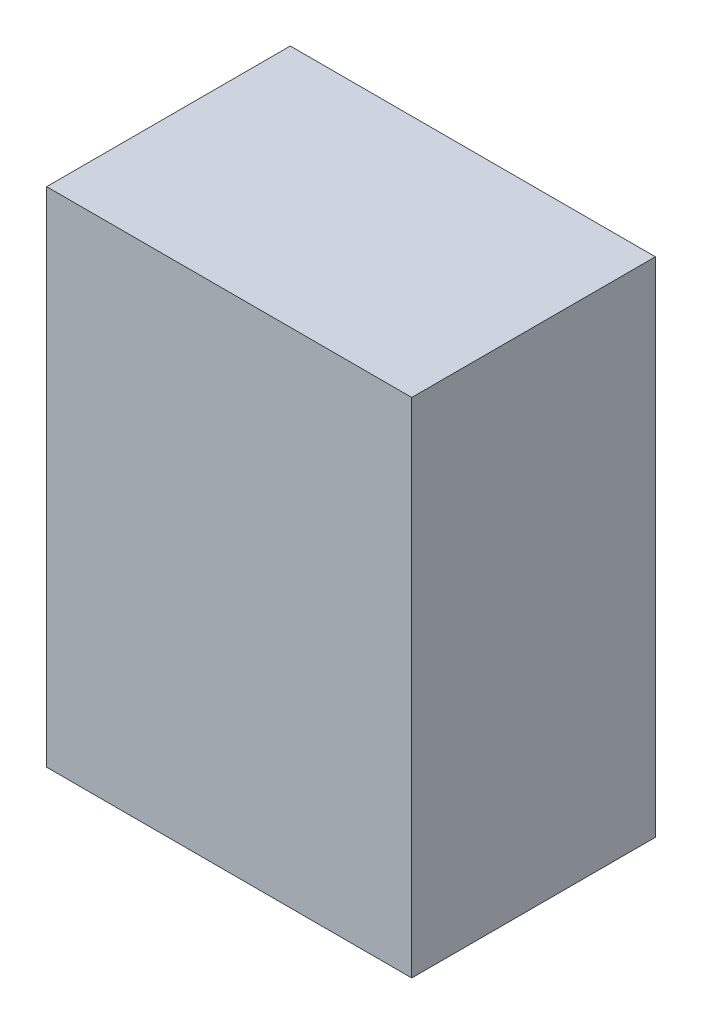
ISO-10303-21;
HEADER;
FILE_DESCRIPTION(('STEP AP214'),'2;1');
FILE_NAME('part.step','',(''),(''),'','','');
FILE_SCHEMA(('AUTOMOTIVE_DESIGN { 1 0 10303 214 1 1 1 1 }'));
ENDSEC;
DATA;
#1=APPLICATION_CONTEXT('core data for automotive mechanical design processes');
#2=APPLICATION_PROTOCOL_DEFINITION('international standard','automotive_design',2000,#1);
#3=PRODUCT_CONTEXT('',#1,'mechanical');
#4=PRODUCT('Part','Part','',(#3));
#5=PRODUCT_RELATED_PRODUCT_CATEGORY('part','',(#4));
#6=PRODUCT_DEFINITION_FORMATION('','',#4);
#7=PRODUCT_DEFINITION_CONTEXT('part definition',#1,'design');
#8=PRODUCT_DEFINITION('design','',#6,#7);
#9=PRODUCT_DEFINITION_SHAPE('','',#8);
#10=(LENGTH_UNIT() NAMED_UNIT(*) SI_UNIT(.MILLI.,.METRE.));
#11=(NAMED_UNIT(*) PLANE_ANGLE_UNIT() SI_UNIT($,.RADIAN.));
#12=(NAMED_UNIT(*) SI_UNIT($,.STERADIAN.) SOLID_ANGLE_UNIT());
#13=UNCERTAINTY_MEASURE_WITH_UNIT(LENGTH_MEASURE(1.E-05),#10,'distance_accuracy_value','');
#14=(GEOMETRIC_REPRESENTATION_CONTEXT(3) GLOBAL_UNCERTAINTY_ASSIGNED_CONTEXT((#13)) GLOBAL_UNIT_ASSIGNED_CONTEXT((#10,
#11,#12)) REPRESENTATION_CONTEXT('',''));
#15=CARTESIAN_POINT('',(0.,0.,0.));
#16=DIRECTION('',(0.,0.,1.));
#17=DIRECTION('',(1.,0.,0.));
#18=AXIS2_PLACEMENT_3D('',#15,#16,#17);
#19=CARTESIAN_POINT('',(4.3942,6.2484,10.));
#20=DIRECTION('',(0.,0.,-1.));
#21=DIRECTION('',(-1.,0.,0.));
#22=AXIS2_PLACEMENT_3D('',#19,#20,#21);
#23=PLANE('',#22);
#24=DIRECTION('',(0.,1.,0.));
#25=VECTOR('',#24,1.);
#26=CARTESIAN_POINT('',(-7.5946,6.2484,10.));
#27=LINE('',#26,#25);
#28=CARTESIAN_POINT('',(-7.5946,6.2484,10.));
#29=VERTEX_POINT('',#28);
#30=CARTESIAN_POINT('',(-7.5946,-10.2616,10.));
#31=VERTEX_POINT('',#30);
#32=EDGE_CURVE('E55',#29,#31,#27,.F.);
#33=ORIENTED_EDGE('',*,*,#32,.T.);
#34=DIRECTION('',(1.,0.,0.));
#35=VECTOR('',#34,1.);
#36=CARTESIAN_POINT('',(-7.5946,-10.2616,10.));
#37=LINE('',#36,#35);
#38=CARTESIAN_POINT('',(4.3942,-10.2616,10.));
#39=VERTEX_POINT('',#38);
#40=EDGE_CURVE('E57',#31,#39,#37,.T.);
#41=ORIENTED_EDGE('',*,*,#40,.T.);
#42=DIRECTION('',(0.,1.,0.));
#43=VECTOR('',#42,1.);
#44=CARTESIAN_POINT('',(4.3942,-10.2616,10.));
#45=LINE('',#44,#43);
#46=CARTESIAN_POINT('',(4.3942,6.2484,10.));
#47=VERTEX_POINT('',#46);
#48=EDGE_CURVE('E20',#39,#47,#45,.T.);
#49=ORIENTED_EDGE('',*,*,#48,.T.);
#50=DIRECTION('',(1.,0.,0.));
#51=VECTOR('',#50,1.);
#52=CARTESIAN_POINT('',(4.3942,6.2484,10.));
#53=LINE('',#52,#51);
#54=EDGE_CURVE('E80',#47,#29,#53,.F.);
#55=ORIENTED_EDGE('',*,*,#54,.T.);
#56=EDGE_LOOP('',(#33,#41,#49,#55));
#57=FACE_BOUND('',#56,.T.);
#58=ADVANCED_FACE('F17',(#57),#23,.F.);
#59=CARTESIAN_POINT('',(4.3942,-10.2616,2.));
#60=DIRECTION('',(-1.,0.,0.));
#61=DIRECTION('',(0.,0.,1.));
#62=AXIS2_PLACEMENT_3D('',#59,#60,#61);
#63=PLANE('',#62);
#64=DIRECTION('',(0.,0.,-1.));
#65=VECTOR('',#64,1.);
#66=CARTESIAN_POINT('',(4.3942,6.2484,2.));
#67=LINE('',#66,#65);
#68=CARTESIAN_POINT('',(4.3942,6.2484,2.));
#69=VERTEX_POINT('',#68);
#70=EDGE_CURVE('E68',#69,#47,#67,.F.);
#71=ORIENTED_EDGE('',*,*,#70,.T.);
#72=ORIENTED_EDGE('',*,*,#48,.F.);
#73=DIRECTION('',(0.,0.,1.));
#74=VECTOR('',#73,1.);
#75=CARTESIAN_POINT('',(4.3942,-10.2616,2.));
#76=LINE('',#75,#74);
#77=CARTESIAN_POINT('',(4.3942,-10.2616,2.));
#78=VERTEX_POINT('',#77);
#79=EDGE_CURVE('E63',#39,#78,#76,.F.);
#80=ORIENTED_EDGE('',*,*,#79,.T.);
#81=DIRECTION('',(0.,1.,0.));
#82=VECTOR('',#81,1.);
#83=CARTESIAN_POINT('',(4.3942,6.2484,2.));
#84=LINE('',#83,#82);
#85=EDGE_CURVE('E83',#69,#78,#84,.F.);
#86=ORIENTED_EDGE('',*,*,#85,.F.);
#87=EDGE_LOOP('',(#71,#72,#80,#86));
#88=FACE_BOUND('',#87,.T.);
#89=ADVANCED_FACE('F65',(#88),#63,.F.);
#90=CARTESIAN_POINT('',(-7.5946,-10.2616,2.));
#91=DIRECTION('',(0.,1.,0.));
#92=DIRECTION('',(0.,0.,1.));
#93=AXIS2_PLACEMENT_3D('',#90,#91,#92);
#94=PLANE('',#93);
#95=ORIENTED_EDGE('',*,*,#79,.F.);
#96=ORIENTED_EDGE('',*,*,#40,.F.);
#97=DIRECTION('',(0.,0.,-1.));
#98=VECTOR('',#97,1.);
#99=CARTESIAN_POINT('',(-7.5946,-10.2616,2.));
#100=LINE('',#99,#98);
#101=CARTESIAN_POINT('',(-7.5946,-10.2616,2.));
#102=VERTEX_POINT('',#101);
#103=EDGE_CURVE('E75',#31,#102,#100,.T.);
#104=ORIENTED_EDGE('',*,*,#103,.T.);
#105=DIRECTION('',(-1.,0.,0.));
#106=VECTOR('',#105,1.);
#107=CARTESIAN_POINT('',(4.3942,-10.2616,2.));
#108=LINE('',#107,#106);
#109=EDGE_CURVE('E72',#78,#102,#108,.T.);
#110=ORIENTED_EDGE('',*,*,#109,.F.);
#111=EDGE_LOOP('',(#95,#96,#104,#110));
#112=FACE_BOUND('',#111,.T.);
#113=ADVANCED_FACE('F70',(#112),#94,.F.);
#114=CARTESIAN_POINT('',(-7.5946,6.2484,2.));
#115=DIRECTION('',(1.,0.,0.));
#116=DIRECTION('',(0.,0.,-1.));
#117=AXIS2_PLACEMENT_3D('',#114,#115,#116);
#118=PLANE('',#117);
#119=ORIENTED_EDGE('',*,*,#103,.F.);
#120=ORIENTED_EDGE('',*,*,#32,.F.);
#121=DIRECTION('',(0.,0.,-1.));
#122=VECTOR('',#121,1.);
#123=CARTESIAN_POINT('',(-7.5946,6.2484,2.));
#124=LINE('',#123,#122);
#125=CARTESIAN_POINT('',(-7.5946,6.2484,2.));
#126=VERTEX_POINT('',#125);
#127=EDGE_CURVE('E35',#29,#126,#124,.T.);
#128=ORIENTED_EDGE('',*,*,#127,.T.);
#129=DIRECTION('',(0.,1.,0.));
#130=VECTOR('',#129,1.);
#131=CARTESIAN_POINT('',(-7.5946,6.2484,2.));
#132=LINE('',#131,#130);
#133=EDGE_CURVE('E26',#102,#126,#132,.T.);
#134=ORIENTED_EDGE('',*,*,#133,.F.);
#135=EDGE_LOOP('',(#119,#120,#128,#134));
#136=FACE_BOUND('',#135,.T.);
#137=ADVANCED_FACE('F89',(#136),#118,.F.);
#138=CARTESIAN_POINT('',(4.3942,6.2484,2.));
#139=DIRECTION('',(0.,-1.,0.));
#140=DIRECTION('',(0.,0.,-1.));
#141=AXIS2_PLACEMENT_3D('',#138,#139,#140);
#142=PLANE('',#141);
#143=ORIENTED_EDGE('',*,*,#127,.F.);
#144=ORIENTED_EDGE('',*,*,#54,.F.);
#145=ORIENTED_EDGE('',*,*,#70,.F.);
#146=DIRECTION('',(-1.,0.,0.));
#147=VECTOR('',#146,1.);
#148=CARTESIAN_POINT('',(4.3942,6.2484,2.));
#149=LINE('',#148,#147);
#150=EDGE_CURVE('E11',#126,#69,#149,.F.);
#151=ORIENTED_EDGE('',*,*,#150,.F.);
#152=EDGE_LOOP('',(#143,#144,#145,#151));
#153=FACE_BOUND('',#152,.T.);
#154=ADVANCED_FACE('F91',(#153),#142,.F.);
#155=CARTESIAN_POINT('',(4.3942,6.2484,2.));
#156=DIRECTION('',(0.,0.,-1.));
#157=DIRECTION('',(-1.,0.,0.));
#158=AXIS2_PLACEMENT_3D('',#155,#156,#157);
#159=PLANE('',#158);
#160=ORIENTED_EDGE('',*,*,#133,.T.);
#161=ORIENTED_EDGE('',*,*,#150,.T.);
#162=ORIENTED_EDGE('',*,*,#85,.T.);
#163=ORIENTED_EDGE('',*,*,#109,.T.);
#164=EDGE_LOOP('',(#160,#161,#162,#163));
#165=FACE_BOUND('',#164,.T.);
#166=ADVANCED_FACE('F88',(#165),#159,.T.);
#167=CLOSED_SHELL('',(#58,#89,#113,#137,#154,#166));
#168=MANIFOLD_SOLID_BREP('B1',#167);
#169=ADVANCED_BREP_SHAPE_REPRESENTATION('',(#18,#168),#14);
#170=SHAPE_DEFINITION_REPRESENTATION(#9,#169);
ENDSEC;
END-ISO-10303-21;
